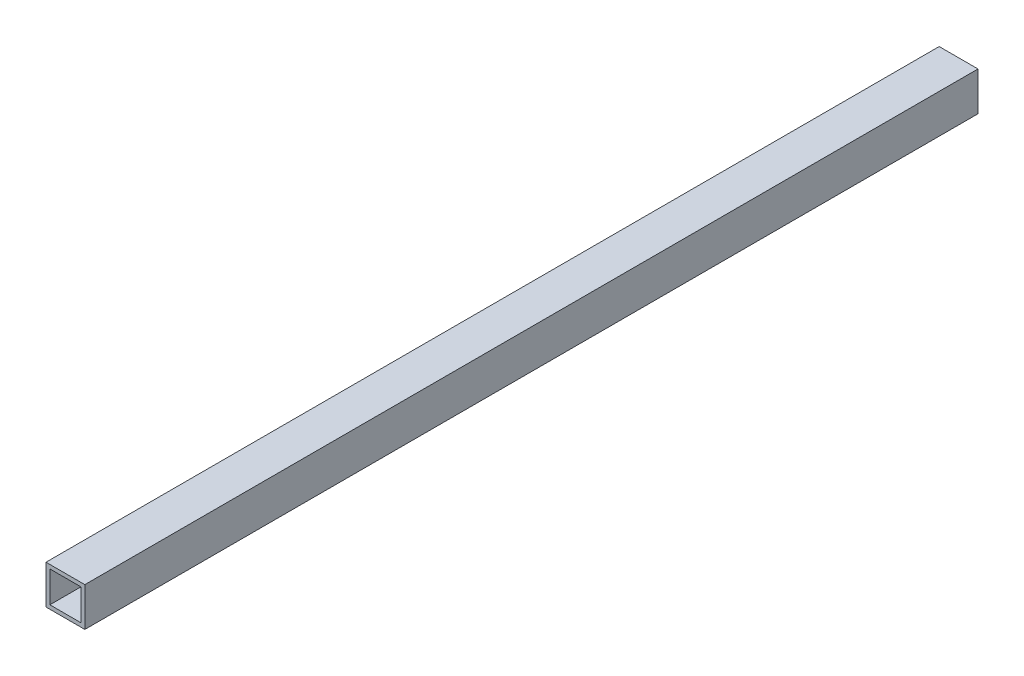
ISO-10303-21;
HEADER;
FILE_DESCRIPTION(('STEP AP214'),'2;1');
FILE_NAME('part.step','',(''),(''),'','','');
FILE_SCHEMA(('AUTOMOTIVE_DESIGN { 1 0 10303 214 1 1 1 1 }'));
ENDSEC;
DATA;
#1=APPLICATION_CONTEXT('core data for automotive mechanical design processes');
#2=APPLICATION_PROTOCOL_DEFINITION('international standard','automotive_design',2000,#1);
#3=PRODUCT_CONTEXT('',#1,'mechanical');
#4=PRODUCT('Part','Part','',(#3));
#5=PRODUCT_RELATED_PRODUCT_CATEGORY('part','',(#4));
#6=PRODUCT_DEFINITION_FORMATION('','',#4);
#7=PRODUCT_DEFINITION_CONTEXT('part definition',#1,'design');
#8=PRODUCT_DEFINITION('design','',#6,#7);
#9=PRODUCT_DEFINITION_SHAPE('','',#8);
#10=(LENGTH_UNIT() NAMED_UNIT(*) SI_UNIT(.MILLI.,.METRE.));
#11=(NAMED_UNIT(*) PLANE_ANGLE_UNIT() SI_UNIT($,.RADIAN.));
#12=(NAMED_UNIT(*) SI_UNIT($,.STERADIAN.) SOLID_ANGLE_UNIT());
#13=UNCERTAINTY_MEASURE_WITH_UNIT(LENGTH_MEASURE(1.E-05),#10,'distance_accuracy_value','');
#14=(GEOMETRIC_REPRESENTATION_CONTEXT(3) GLOBAL_UNCERTAINTY_ASSIGNED_CONTEXT((#13)) GLOBAL_UNIT_ASSIGNED_CONTEXT((#10,
#11,#12)) REPRESENTATION_CONTEXT('',''));
#15=CARTESIAN_POINT('',(0.,0.,0.));
#16=DIRECTION('',(0.,0.,1.));
#17=DIRECTION('',(1.,0.,0.));
#18=AXIS2_PLACEMENT_3D('',#15,#16,#17);
#19=CARTESIAN_POINT('',(0.,0.,230.));
#20=DIRECTION('',(0.,0.,-1.));
#21=DIRECTION('',(-1.,0.,0.));
#22=AXIS2_PLACEMENT_3D('',#19,#20,#21);
#23=PLANE('',#22);
#24=DIRECTION('',(0.,1.,0.));
#25=VECTOR('',#24,1.);
#26=CARTESIAN_POINT('',(10.,-10.,230.));
#27=LINE('',#26,#25);
#28=CARTESIAN_POINT('',(10.,-10.,230.));
#29=VERTEX_POINT('',#28);
#30=CARTESIAN_POINT('',(10.,10.,230.));
#31=VERTEX_POINT('',#30);
#32=EDGE_CURVE('E145',#29,#31,#27,.T.);
#33=ORIENTED_EDGE('',*,*,#32,.T.);
#34=DIRECTION('',(-1.,0.,0.));
#35=VECTOR('',#34,1.);
#36=CARTESIAN_POINT('',(-10.,10.,230.));
#37=LINE('',#36,#35);
#38=CARTESIAN_POINT('',(-10.,10.,230.));
#39=VERTEX_POINT('',#38);
#40=EDGE_CURVE('E143',#31,#39,#37,.T.);
#41=ORIENTED_EDGE('',*,*,#40,.T.);
#42=DIRECTION('',(0.,-1.,0.));
#43=VECTOR('',#42,1.);
#44=CARTESIAN_POINT('',(-10.,-10.,230.));
#45=LINE('',#44,#43);
#46=CARTESIAN_POINT('',(-10.,-10.,230.));
#47=VERTEX_POINT('',#46);
#48=EDGE_CURVE('E149',#39,#47,#45,.T.);
#49=ORIENTED_EDGE('',*,*,#48,.T.);
#50=DIRECTION('',(1.,0.,0.));
#51=VECTOR('',#50,1.);
#52=CARTESIAN_POINT('',(-10.,-10.,230.));
#53=LINE('',#52,#51);
#54=EDGE_CURVE('E148',#47,#29,#53,.T.);
#55=ORIENTED_EDGE('',*,*,#54,.T.);
#56=EDGE_LOOP('',(#33,#41,#49,#55));
#57=FACE_BOUND('',#56,.T.);
#58=DIRECTION('',(0.,1.,0.));
#59=VECTOR('',#58,1.);
#60=CARTESIAN_POINT('',(8.,-8.,230.));
#61=LINE('',#60,#59);
#62=CARTESIAN_POINT('',(8.,-8.,230.));
#63=VERTEX_POINT('',#62);
#64=CARTESIAN_POINT('',(8.,8.,230.));
#65=VERTEX_POINT('',#64);
#66=EDGE_CURVE('E106',#63,#65,#61,.T.);
#67=ORIENTED_EDGE('',*,*,#66,.F.);
#68=DIRECTION('',(1.,0.,0.));
#69=VECTOR('',#68,1.);
#70=CARTESIAN_POINT('',(-8.,-8.,230.));
#71=LINE('',#70,#69);
#72=CARTESIAN_POINT('',(-8.,-8.,230.));
#73=VERTEX_POINT('',#72);
#74=EDGE_CURVE('E129',#73,#63,#71,.T.);
#75=ORIENTED_EDGE('',*,*,#74,.F.);
#76=DIRECTION('',(0.,-1.,0.));
#77=VECTOR('',#76,1.);
#78=CARTESIAN_POINT('',(-8.,-8.,230.));
#79=LINE('',#78,#77);
#80=CARTESIAN_POINT('',(-8.,8.,230.));
#81=VERTEX_POINT('',#80);
#82=EDGE_CURVE('E127',#81,#73,#79,.T.);
#83=ORIENTED_EDGE('',*,*,#82,.F.);
#84=DIRECTION('',(-1.,0.,0.));
#85=VECTOR('',#84,1.);
#86=CARTESIAN_POINT('',(-8.,8.,230.));
#87=LINE('',#86,#85);
#88=EDGE_CURVE('E112',#65,#81,#87,.T.);
#89=ORIENTED_EDGE('',*,*,#88,.F.);
#90=EDGE_LOOP('',(#67,#75,#83,#89));
#91=FACE_BOUND('',#90,.T.);
#92=ADVANCED_FACE('F41',(#57,#91),#23,.F.);
#93=CARTESIAN_POINT('',(0.,0.,-230.));
#94=DIRECTION('',(0.,0.,-1.));
#95=DIRECTION('',(-1.,0.,0.));
#96=AXIS2_PLACEMENT_3D('',#93,#94,#95);
#97=PLANE('',#96);
#98=DIRECTION('',(0.,1.,0.));
#99=VECTOR('',#98,1.);
#100=CARTESIAN_POINT('',(10.,-10.,-230.));
#101=LINE('',#100,#99);
#102=CARTESIAN_POINT('',(10.,-10.,-230.));
#103=VERTEX_POINT('',#102);
#104=CARTESIAN_POINT('',(10.,10.,-230.));
#105=VERTEX_POINT('',#104);
#106=EDGE_CURVE('E125',#103,#105,#101,.T.);
#107=ORIENTED_EDGE('',*,*,#106,.F.);
#108=DIRECTION('',(1.,0.,0.));
#109=VECTOR('',#108,1.);
#110=CARTESIAN_POINT('',(-10.,-10.,-230.));
#111=LINE('',#110,#109);
#112=CARTESIAN_POINT('',(-10.,-10.,-230.));
#113=VERTEX_POINT('',#112);
#114=EDGE_CURVE('E147',#113,#103,#111,.T.);
#115=ORIENTED_EDGE('',*,*,#114,.F.);
#116=DIRECTION('',(0.,-1.,0.));
#117=VECTOR('',#116,1.);
#118=CARTESIAN_POINT('',(-10.,-10.,-230.));
#119=LINE('',#118,#117);
#120=CARTESIAN_POINT('',(-10.,10.,-230.));
#121=VERTEX_POINT('',#120);
#122=EDGE_CURVE('E159',#121,#113,#119,.T.);
#123=ORIENTED_EDGE('',*,*,#122,.F.);
#124=DIRECTION('',(-1.,0.,0.));
#125=VECTOR('',#124,1.);
#126=CARTESIAN_POINT('',(-10.,10.,-230.));
#127=LINE('',#126,#125);
#128=EDGE_CURVE('E152',#105,#121,#127,.T.);
#129=ORIENTED_EDGE('',*,*,#128,.F.);
#130=EDGE_LOOP('',(#107,#115,#123,#129));
#131=FACE_BOUND('',#130,.T.);
#132=DIRECTION('',(1.,0.,0.));
#133=VECTOR('',#132,1.);
#134=CARTESIAN_POINT('',(-8.,-8.,-230.));
#135=LINE('',#134,#133);
#136=CARTESIAN_POINT('',(-8.,-8.,-230.));
#137=VERTEX_POINT('',#136);
#138=CARTESIAN_POINT('',(8.,-8.,-230.));
#139=VERTEX_POINT('',#138);
#140=EDGE_CURVE('E114',#137,#139,#135,.T.);
#141=ORIENTED_EDGE('',*,*,#140,.T.);
#142=DIRECTION('',(0.,1.,0.));
#143=VECTOR('',#142,1.);
#144=CARTESIAN_POINT('',(8.,-8.,-230.));
#145=LINE('',#144,#143);
#146=CARTESIAN_POINT('',(8.,8.,-230.));
#147=VERTEX_POINT('',#146);
#148=EDGE_CURVE('E61',#139,#147,#145,.T.);
#149=ORIENTED_EDGE('',*,*,#148,.T.);
#150=DIRECTION('',(-1.,0.,0.));
#151=VECTOR('',#150,1.);
#152=CARTESIAN_POINT('',(-8.,8.,-230.));
#153=LINE('',#152,#151);
#154=CARTESIAN_POINT('',(-8.,8.,-230.));
#155=VERTEX_POINT('',#154);
#156=EDGE_CURVE('E122',#147,#155,#153,.T.);
#157=ORIENTED_EDGE('',*,*,#156,.T.);
#158=DIRECTION('',(0.,-1.,0.));
#159=VECTOR('',#158,1.);
#160=CARTESIAN_POINT('',(-8.,-8.,-230.));
#161=LINE('',#160,#159);
#162=EDGE_CURVE('E134',#155,#137,#161,.T.);
#163=ORIENTED_EDGE('',*,*,#162,.T.);
#164=EDGE_LOOP('',(#141,#149,#157,#163));
#165=FACE_BOUND('',#164,.T.);
#166=ADVANCED_FACE('F174',(#131,#165),#97,.T.);
#167=CARTESIAN_POINT('',(10.,-10.,230.));
#168=DIRECTION('',(-1.,0.,0.));
#169=DIRECTION('',(0.,0.,1.));
#170=AXIS2_PLACEMENT_3D('',#167,#168,#169);
#171=PLANE('',#170);
#172=ORIENTED_EDGE('',*,*,#106,.T.);
#173=DIRECTION('',(0.,0.,-1.));
#174=VECTOR('',#173,1.);
#175=CARTESIAN_POINT('',(10.,10.,230.));
#176=LINE('',#175,#174);
#177=EDGE_CURVE('E11',#31,#105,#176,.T.);
#178=ORIENTED_EDGE('',*,*,#177,.F.);
#179=ORIENTED_EDGE('',*,*,#32,.F.);
#180=DIRECTION('',(0.,0.,-1.));
#181=VECTOR('',#180,1.);
#182=CARTESIAN_POINT('',(10.,-10.,230.));
#183=LINE('',#182,#181);
#184=EDGE_CURVE('E155',#29,#103,#183,.T.);
#185=ORIENTED_EDGE('',*,*,#184,.T.);
#186=EDGE_LOOP('',(#172,#178,#179,#185));
#187=FACE_BOUND('',#186,.T.);
#188=ADVANCED_FACE('F43',(#187),#171,.F.);
#189=CARTESIAN_POINT('',(-10.,10.,230.));
#190=DIRECTION('',(0.,-1.,0.));
#191=DIRECTION('',(0.,0.,-1.));
#192=AXIS2_PLACEMENT_3D('',#189,#190,#191);
#193=PLANE('',#192);
#194=ORIENTED_EDGE('',*,*,#128,.T.);
#195=DIRECTION('',(0.,0.,-1.));
#196=VECTOR('',#195,1.);
#197=CARTESIAN_POINT('',(-10.,10.,230.));
#198=LINE('',#197,#196);
#199=EDGE_CURVE('E47',#39,#121,#198,.T.);
#200=ORIENTED_EDGE('',*,*,#199,.F.);
#201=ORIENTED_EDGE('',*,*,#40,.F.);
#202=ORIENTED_EDGE('',*,*,#177,.T.);
#203=EDGE_LOOP('',(#194,#200,#201,#202));
#204=FACE_BOUND('',#203,.T.);
#205=ADVANCED_FACE('F184',(#204),#193,.F.);
#206=CARTESIAN_POINT('',(-10.,-10.,230.));
#207=DIRECTION('',(1.,0.,0.));
#208=DIRECTION('',(0.,0.,-1.));
#209=AXIS2_PLACEMENT_3D('',#206,#207,#208);
#210=PLANE('',#209);
#211=ORIENTED_EDGE('',*,*,#122,.T.);
#212=DIRECTION('',(0.,0.,-1.));
#213=VECTOR('',#212,1.);
#214=CARTESIAN_POINT('',(-10.,-10.,230.));
#215=LINE('',#214,#213);
#216=EDGE_CURVE('E162',#47,#113,#215,.T.);
#217=ORIENTED_EDGE('',*,*,#216,.F.);
#218=ORIENTED_EDGE('',*,*,#48,.F.);
#219=ORIENTED_EDGE('',*,*,#199,.T.);
#220=EDGE_LOOP('',(#211,#217,#218,#219));
#221=FACE_BOUND('',#220,.T.);
#222=ADVANCED_FACE('F169',(#221),#210,.F.);
#223=CARTESIAN_POINT('',(-10.,-10.,230.));
#224=DIRECTION('',(0.,1.,0.));
#225=DIRECTION('',(0.,0.,1.));
#226=AXIS2_PLACEMENT_3D('',#223,#224,#225);
#227=PLANE('',#226);
#228=ORIENTED_EDGE('',*,*,#114,.T.);
#229=ORIENTED_EDGE('',*,*,#184,.F.);
#230=ORIENTED_EDGE('',*,*,#54,.F.);
#231=ORIENTED_EDGE('',*,*,#216,.T.);
#232=EDGE_LOOP('',(#228,#229,#230,#231));
#233=FACE_BOUND('',#232,.T.);
#234=ADVANCED_FACE('F177',(#233),#227,.F.);
#235=CARTESIAN_POINT('',(8.,-8.,230.));
#236=DIRECTION('',(-1.,0.,0.));
#237=DIRECTION('',(0.,0.,1.));
#238=AXIS2_PLACEMENT_3D('',#235,#236,#237);
#239=PLANE('',#238);
#240=ORIENTED_EDGE('',*,*,#148,.F.);
#241=DIRECTION('',(0.,0.,-1.));
#242=VECTOR('',#241,1.);
#243=CARTESIAN_POINT('',(8.,-8.,230.));
#244=LINE('',#243,#242);
#245=EDGE_CURVE('E109',#63,#139,#244,.T.);
#246=ORIENTED_EDGE('',*,*,#245,.F.);
#247=ORIENTED_EDGE('',*,*,#66,.T.);
#248=DIRECTION('',(0.,0.,-1.));
#249=VECTOR('',#248,1.);
#250=CARTESIAN_POINT('',(8.,8.,230.));
#251=LINE('',#250,#249);
#252=EDGE_CURVE('E107',#65,#147,#251,.T.);
#253=ORIENTED_EDGE('',*,*,#252,.T.);
#254=EDGE_LOOP('',(#240,#246,#247,#253));
#255=FACE_BOUND('',#254,.T.);
#256=ADVANCED_FACE('F108',(#255),#239,.T.);
#257=CARTESIAN_POINT('',(-8.,8.,230.));
#258=DIRECTION('',(0.,-1.,0.));
#259=DIRECTION('',(0.,0.,-1.));
#260=AXIS2_PLACEMENT_3D('',#257,#258,#259);
#261=PLANE('',#260);
#262=ORIENTED_EDGE('',*,*,#156,.F.);
#263=ORIENTED_EDGE('',*,*,#252,.F.);
#264=ORIENTED_EDGE('',*,*,#88,.T.);
#265=DIRECTION('',(0.,0.,-1.));
#266=VECTOR('',#265,1.);
#267=CARTESIAN_POINT('',(-8.,8.,230.));
#268=LINE('',#267,#266);
#269=EDGE_CURVE('E124',#81,#155,#268,.T.);
#270=ORIENTED_EDGE('',*,*,#269,.T.);
#271=EDGE_LOOP('',(#262,#263,#264,#270));
#272=FACE_BOUND('',#271,.T.);
#273=ADVANCED_FACE('F117',(#272),#261,.T.);
#274=CARTESIAN_POINT('',(-8.,-8.,230.));
#275=DIRECTION('',(1.,0.,0.));
#276=DIRECTION('',(0.,0.,-1.));
#277=AXIS2_PLACEMENT_3D('',#274,#275,#276);
#278=PLANE('',#277);
#279=ORIENTED_EDGE('',*,*,#162,.F.);
#280=ORIENTED_EDGE('',*,*,#269,.F.);
#281=ORIENTED_EDGE('',*,*,#82,.T.);
#282=DIRECTION('',(0.,0.,-1.));
#283=VECTOR('',#282,1.);
#284=CARTESIAN_POINT('',(-8.,-8.,230.));
#285=LINE('',#284,#283);
#286=EDGE_CURVE('E57',#73,#137,#285,.T.);
#287=ORIENTED_EDGE('',*,*,#286,.T.);
#288=EDGE_LOOP('',(#279,#280,#281,#287));
#289=FACE_BOUND('',#288,.T.);
#290=ADVANCED_FACE('F206',(#289),#278,.T.);
#291=CARTESIAN_POINT('',(-8.,-8.,230.));
#292=DIRECTION('',(0.,1.,0.));
#293=DIRECTION('',(0.,0.,1.));
#294=AXIS2_PLACEMENT_3D('',#291,#292,#293);
#295=PLANE('',#294);
#296=ORIENTED_EDGE('',*,*,#140,.F.);
#297=ORIENTED_EDGE('',*,*,#286,.F.);
#298=ORIENTED_EDGE('',*,*,#74,.T.);
#299=ORIENTED_EDGE('',*,*,#245,.T.);
#300=EDGE_LOOP('',(#296,#297,#298,#299));
#301=FACE_BOUND('',#300,.T.);
#302=ADVANCED_FACE('F215',(#301),#295,.T.);
#303=CLOSED_SHELL('',(#92,#166,#188,#205,#222,#234,#256,#273,#290,#302));
#304=MANIFOLD_SOLID_BREP('B2',#303);
#305=ADVANCED_BREP_SHAPE_REPRESENTATION('',(#18,#304),#14);
#306=SHAPE_DEFINITION_REPRESENTATION(#9,#305);
ENDSEC;
END-ISO-10303-21;
